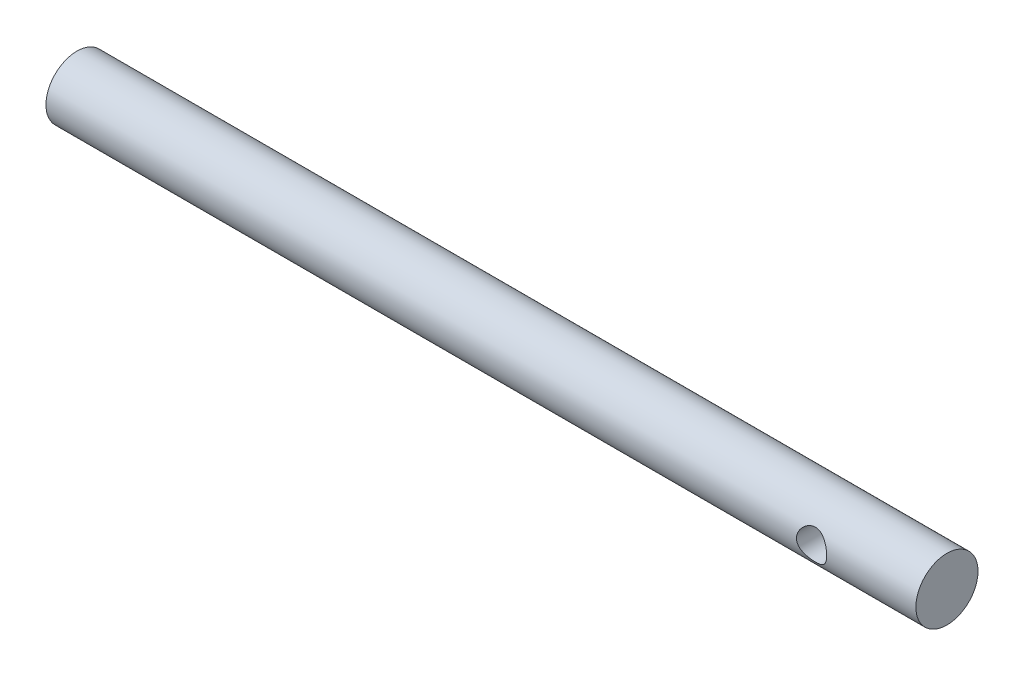
ISO-10303-21;
HEADER;
FILE_DESCRIPTION(('STEP AP214'),'2;1');
FILE_NAME('part.step','',(''),(''),'','','');
FILE_SCHEMA(('AUTOMOTIVE_DESIGN { 1 0 10303 214 1 1 1 1 }'));
ENDSEC;
DATA;
#1=APPLICATION_CONTEXT('core data for automotive mechanical design processes');
#2=APPLICATION_PROTOCOL_DEFINITION('international standard','automotive_design',2000,#1);
#3=PRODUCT_CONTEXT('',#1,'mechanical');
#4=PRODUCT('Part','Part','',(#3));
#5=PRODUCT_RELATED_PRODUCT_CATEGORY('part','',(#4));
#6=PRODUCT_DEFINITION_FORMATION('','',#4);
#7=PRODUCT_DEFINITION_CONTEXT('part definition',#1,'design');
#8=PRODUCT_DEFINITION('design','',#6,#7);
#9=PRODUCT_DEFINITION_SHAPE('','',#8);
#10=(LENGTH_UNIT() NAMED_UNIT(*) SI_UNIT(.MILLI.,.METRE.));
#11=(NAMED_UNIT(*) PLANE_ANGLE_UNIT() SI_UNIT($,.RADIAN.));
#12=(NAMED_UNIT(*) SI_UNIT($,.STERADIAN.) SOLID_ANGLE_UNIT());
#13=UNCERTAINTY_MEASURE_WITH_UNIT(LENGTH_MEASURE(1.E-05),#10,'distance_accuracy_value','');
#14=(GEOMETRIC_REPRESENTATION_CONTEXT(3) GLOBAL_UNCERTAINTY_ASSIGNED_CONTEXT((#13)) GLOBAL_UNIT_ASSIGNED_CONTEXT((#10,
#11,#12)) REPRESENTATION_CONTEXT('',''));
#15=CARTESIAN_POINT('',(0.,0.,0.));
#16=DIRECTION('',(0.,0.,1.));
#17=DIRECTION('',(1.,0.,0.));
#18=AXIS2_PLACEMENT_3D('',#15,#16,#17);
#19=CARTESIAN_POINT('',(49.,0.,0.));
#20=DIRECTION('',(-1.,0.,0.));
#21=DIRECTION('',(0.,0.,1.));
#22=AXIS2_PLACEMENT_3D('',#19,#20,#21);
#23=CYLINDRICAL_SURFACE('',#22,3.5);
#24=CARTESIAN_POINT('',(49.,0.,0.));
#25=DIRECTION('',(1.,0.,0.));
#26=DIRECTION('',(0.,0.,-1.));
#27=AXIS2_PLACEMENT_3D('',#24,#25,#26);
#28=CIRCLE('',#27,3.5);
#29=CARTESIAN_POINT('',(49.,0.,-3.49999999999999));
#30=VERTEX_POINT('',#29);
#31=EDGE_CURVE('E10',#30,#30,#28,.T.);
#32=ORIENTED_EDGE('',*,*,#31,.F.);
#33=EDGE_LOOP('',(#32));
#34=FACE_BOUND('',#33,.T.);
#35=CARTESIAN_POINT('',(-49.,0.,0.));
#36=DIRECTION('',(1.,0.,0.));
#37=DIRECTION('',(0.,0.,-1.));
#38=AXIS2_PLACEMENT_3D('',#35,#36,#37);
#39=CIRCLE('',#38,3.5);
#40=CARTESIAN_POINT('',(-49.,0.,-3.5));
#41=VERTEX_POINT('',#40);
#42=EDGE_CURVE('E51',#41,#41,#39,.T.);
#43=ORIENTED_EDGE('',*,*,#42,.T.);
#44=EDGE_LOOP('',(#43));
#45=FACE_BOUND('',#44,.T.);
#46=CARTESIAN_POINT('',(35.55,0.,-3.49999999999999));
#47=CARTESIAN_POINT('',(35.5500053723751,0.0896756953816863,-3.49999539940846));
#48=CARTESIAN_POINT('',(35.557137411082,0.179467316627251,-3.49651613180829));
#49=CARTESIAN_POINT('',(35.5853591509432,0.356415853893428,-3.48294153795161));
#50=CARTESIAN_POINT('',(35.6064773166589,0.443567016997578,-3.4728327196457));
#51=CARTESIAN_POINT('',(35.661660840534,0.612401330099423,-3.44706113400838));
#52=CARTESIAN_POINT('',(35.6956768669738,0.694103936802856,-3.43141954352767));
#53=CARTESIAN_POINT('',(35.7754448267484,0.850530713829402,-3.39603267485626));
#54=CARTESIAN_POINT('',(35.8211953929622,0.925255695691441,-3.37628787475679));
#55=CARTESIAN_POINT('',(35.9261624544671,1.07048646353177,-3.33318539392002));
#56=CARTESIAN_POINT('',(35.9860063637197,1.14049569518364,-3.3096845398156));
#57=CARTESIAN_POINT('',(36.1161163457345,1.2699367370952,-3.26221134364195));
#58=CARTESIAN_POINT('',(36.1863898173101,1.32936097188744,-3.23823867742373));
#59=CARTESIAN_POINT('',(36.3414536129895,1.44023139192917,-3.19055406218534));
#60=CARTESIAN_POINT('',(36.4269253000702,1.49079341721295,-3.16698553760054));
#61=CARTESIAN_POINT('',(36.6064358029226,1.57661108306252,-3.1251547668024));
#62=CARTESIAN_POINT('',(36.700468712635,1.61187718033903,-3.10688889838339));
#63=CARTESIAN_POINT('',(36.8888150297183,1.66388700899557,-3.07933536850597));
#64=CARTESIAN_POINT('',(36.9827927046304,1.68159043638042,-3.06958650019304));
#65=CARTESIAN_POINT('',(37.172848947353,1.70092598793138,-3.05891924050297));
#66=CARTESIAN_POINT('',(37.268925564533,1.70257244676056,-3.05799297287378));
#67=CARTESIAN_POINT('',(37.4489752029416,1.69045398551722,-3.06470061621129));
#68=CARTESIAN_POINT('',(37.5331055648645,1.67838334351683,-3.07139359376366));
#69=CARTESIAN_POINT('',(37.6979524087389,1.64209165878018,-3.09094733930902));
#70=CARTESIAN_POINT('',(37.7786678935885,1.61786709343783,-3.10380989540089));
#71=CARTESIAN_POINT('',(37.9366817626431,1.55749576419697,-3.13454492968829));
#72=CARTESIAN_POINT('',(38.0138566599233,1.52108429090292,-3.15252718612714));
#73=CARTESIAN_POINT('',(38.1613614952234,1.43757150842962,-3.19147437904442));
#74=CARTESIAN_POINT('',(38.2316883610022,1.39046543260207,-3.21244064395383));
#75=CARTESIAN_POINT('',(38.372294176781,1.28036911494261,-3.25800647402137));
#76=CARTESIAN_POINT('',(38.4415755080133,1.21615683878016,-3.28274181960351));
#77=CARTESIAN_POINT('',(38.5687876817409,1.07689280263092,-3.33102589218161));
#78=CARTESIAN_POINT('',(38.6267136719831,1.00183643254441,-3.35457410872639));
#79=CARTESIAN_POINT('',(38.731812974068,0.839043870311133,-3.39903015751018));
#80=CARTESIAN_POINT('',(38.7784397342607,0.750910502501838,-3.41978769474006));
#81=CARTESIAN_POINT('',(38.8558349426374,0.566785318859992,-3.45507068657825));
#82=CARTESIAN_POINT('',(38.8866153073456,0.470799471247903,-3.46960082282431));
#83=CARTESIAN_POINT('',(38.929032236538,0.28189261886233,-3.48981839184007));
#84=CARTESIAN_POINT('',(38.9419978635701,0.189336044763265,-3.49611775101836));
#85=CARTESIAN_POINT('',(38.9525485633474,0.0031595761315409,-3.50123499470571));
#86=CARTESIAN_POINT('',(38.9501403259087,-0.0904598382140665,-3.50005613330506));
#87=CARTESIAN_POINT('',(38.9308186291129,-0.26892879796299,-3.49071506966121));
#88=CARTESIAN_POINT('',(38.9149650612239,-0.353923485471058,-3.48306323907214));
#89=CARTESIAN_POINT('',(38.8708303231691,-0.519889247662173,-3.46218343104434));
#90=CARTESIAN_POINT('',(38.8425477471507,-0.600859866026815,-3.44895482281988));
#91=CARTESIAN_POINT('',(38.7735597760054,-0.759243255732134,-3.41764006757537));
#92=CARTESIAN_POINT('',(38.7325107986414,-0.836479268622267,-3.39942148259232));
#93=CARTESIAN_POINT('',(38.6395358018324,-0.983231788516179,-3.35991662677056));
#94=CARTESIAN_POINT('',(38.5876050550235,-1.05274492032133,-3.33862902391745));
#95=CARTESIAN_POINT('',(38.4687029130208,-1.18898546607153,-3.29271218355646));
#96=CARTESIAN_POINT('',(38.4007774247795,-1.25483940537628,-3.26795682180154));
#97=CARTESIAN_POINT('',(38.2547134412761,-1.37458241948863,-3.21942638668646));
#98=CARTESIAN_POINT('',(38.1765689011136,-1.42846436114869,-3.19565190458545));
#99=CARTESIAN_POINT('',(38.0081648639147,-1.52478586589063,-3.15086826297694));
#100=CARTESIAN_POINT('',(37.9175388957536,-1.56666259597845,-3.1300133743454));
#101=CARTESIAN_POINT('',(37.7291796170817,-1.63412429416305,-3.09533506777101));
#102=CARTESIAN_POINT('',(37.6314550927189,-1.65972903236423,-3.08150312123742));
#103=CARTESIAN_POINT('',(37.4415114195141,-1.69165858519211,-3.06408097097614));
#104=CARTESIAN_POINT('',(37.3496367136011,-1.69956772940746,-3.05965118148304));
#105=CARTESIAN_POINT('',(37.1658133015333,-1.70039716793023,-3.05919173966704));
#106=CARTESIAN_POINT('',(37.0738646337807,-1.69332284171251,-3.06315907254766));
#107=CARTESIAN_POINT('',(36.9007332004393,-1.66584532778301,-3.07817582078756));
#108=CARTESIAN_POINT('',(36.8193006162608,-1.64662904433403,-3.08859307975021));
#109=CARTESIAN_POINT('',(36.6608815862105,-1.59682153528451,-3.11463417188391));
#110=CARTESIAN_POINT('',(36.5838965240116,-1.56622679150365,-3.13025961525221));
#111=CARTESIAN_POINT('',(36.430852983517,-1.49221429547022,-3.16624293517704));
#112=CARTESIAN_POINT('',(36.3552040496375,-1.44807328729915,-3.18684818181704));
#113=CARTESIAN_POINT('',(36.2119034725558,-1.34905500369902,-3.23001034259301));
#114=CARTESIAN_POINT('',(36.1442558632688,-1.2941723495072,-3.25256823132409));
#115=CARTESIAN_POINT('',(36.0109988018856,-1.16799409574847,-3.30012481927582));
#116=CARTESIAN_POINT('',(35.946469306425,-1.09554795110436,-3.32511344994222));
#117=CARTESIAN_POINT('',(35.8302743123696,-0.940102971414071,-3.37235811234783));
#118=CARTESIAN_POINT('',(35.7786153291097,-0.857098823660054,-3.39461275720585));
#119=CARTESIAN_POINT('',(35.6898683287502,-0.682351949193356,-3.43401018783732));
#120=CARTESIAN_POINT('',(35.6527979895868,-0.590598786922934,-3.45114676571959));
#121=CARTESIAN_POINT('',(35.5950779113332,-0.401212243294464,-3.4782335251314));
#122=CARTESIAN_POINT('',(35.5743805001216,-0.303596830357162,-3.48820456233759));
#123=CARTESIAN_POINT('',(35.558262914899,-0.170891099951093,-3.49599313386021));
#124=CARTESIAN_POINT('',(35.5551682262268,-0.136809564919142,-3.49749221675948));
#125=CARTESIAN_POINT('',(35.5510357161867,-0.0684909939943334,-3.49949654130655));
#126=CARTESIAN_POINT('',(35.5499979478822,-0.0342539541126767,-3.50000175731507));
#127=CARTESIAN_POINT('',(35.55,0.,-3.49999999999999));
#128=B_SPLINE_CURVE_WITH_KNOTS('',3,(#46,#47,#48,#49,#50,#51,#52,#53,#54,#55,#56,#57,#58,#59,
#60,#61,#62,#63,#64,#65,#66,#67,#68,#69,#70,#71,#72,#73,#74,#75,#76,#77,#78,#79,#80,#81,#82,#83,
#84,#85,#86,#87,#88,#89,#90,#91,#92,#93,#94,#95,#96,#97,#98,#99,#100,#101,#102,#103,#104,#105,
#106,#107,#108,#109,#110,#111,#112,#113,#114,#115,#116,#117,#118,#119,#120,#121,#122,#123,#124,
#125,#126,#127),.UNSPECIFIED.,.T.,.F.,(4,2,2,2,2,2,2,2,2,2,2,2,2,2,2,2,2,2,2,2,2,2,2,2,2,2,2,2,
2,2,2,2,2,2,2,2,2,2,2,2,4),(0.,0.268887687140705,0.538324303048221,0.806740606925696,
1.07512565341812,1.35908673790846,1.64325023812897,1.9479024600614,2.25234608395246,
2.53904682049131,2.82549158498545,3.08006671023077,3.33471566236738,3.59529966787887,
3.85600004604811,4.14766186350512,4.43944804065819,4.74335370234189,5.04703049124303,
5.32652937628635,5.6059066478803,5.86511173893268,6.12434615637607,6.39126951599143,
6.65830907634567,6.95040651611498,7.24267752924817,7.54698910763996,7.85093024385816,
8.12633745853658,8.40164581126933,8.65349917194615,8.90543046963388,9.17428318520365,
9.44327087188504,9.7424338286204,10.0417479218777,10.3414236033631,10.6402234912566,
10.7429294570132,10.8456380722916),.UNSPECIFIED.);
#129=CARTESIAN_POINT('',(35.55,0.,-3.49999999999999));
#130=VERTEX_POINT('',#129);
#131=EDGE_CURVE('E57',#130,#130,#128,.T.);
#132=ORIENTED_EDGE('',*,*,#131,.F.);
#133=EDGE_LOOP('',(#132));
#134=FACE_BOUND('',#133,.T.);
#135=CARTESIAN_POINT('',(38.95,0.,3.50000000000001));
#136=CARTESIAN_POINT('',(38.9499946276248,0.0896756953816863,3.49999539940847));
#137=CARTESIAN_POINT('',(38.942862588918,0.179467316627251,3.4965161318083));
#138=CARTESIAN_POINT('',(38.9146408490568,0.356415853893428,3.48294153795162));
#139=CARTESIAN_POINT('',(38.8935226833411,0.443567016997578,3.47283271964571));
#140=CARTESIAN_POINT('',(38.838339159466,0.612401330099423,3.44706113400839));
#141=CARTESIAN_POINT('',(38.8043231330262,0.694103936802856,3.43141954352768));
#142=CARTESIAN_POINT('',(38.7245551732516,0.850530713829402,3.39603267485627));
#143=CARTESIAN_POINT('',(38.6788046070378,0.925255695691441,3.3762878747568));
#144=CARTESIAN_POINT('',(38.5738375455329,1.07048646353177,3.33318539392003));
#145=CARTESIAN_POINT('',(38.5139936362803,1.14049569518364,3.30968453981561));
#146=CARTESIAN_POINT('',(38.3838836542654,1.2699367370952,3.26221134364196));
#147=CARTESIAN_POINT('',(38.3136101826899,1.32936097188744,3.23823867742374));
#148=CARTESIAN_POINT('',(38.1585463870105,1.44023139192917,3.19055406218535));
#149=CARTESIAN_POINT('',(38.0730746999298,1.49079341721295,3.16698553760055));
#150=CARTESIAN_POINT('',(37.8935641970774,1.57661108306252,3.12515476680242));
#151=CARTESIAN_POINT('',(37.799531287365,1.61187718033903,3.10688889838341));
#152=CARTESIAN_POINT('',(37.6111849702817,1.66388700899556,3.07933536850598));
#153=CARTESIAN_POINT('',(37.5172072953696,1.68159043638041,3.06958650019305));
#154=CARTESIAN_POINT('',(37.327151052647,1.70092598793138,3.05891924050298));
#155=CARTESIAN_POINT('',(37.231074435467,1.70257244676056,3.05799297287379));
#156=CARTESIAN_POINT('',(37.0510247970584,1.69045398551722,3.0647006162113));
#157=CARTESIAN_POINT('',(36.9668944351355,1.67838334351683,3.07139359376368));
#158=CARTESIAN_POINT('',(36.8020475912611,1.64209165878018,3.09094733930903));
#159=CARTESIAN_POINT('',(36.7213321064115,1.61786709343783,3.1038098954009));
#160=CARTESIAN_POINT('',(36.5633182373569,1.55749576419697,3.1345449296883));
#161=CARTESIAN_POINT('',(36.4861433400767,1.52108429090292,3.15252718612715));
#162=CARTESIAN_POINT('',(36.3386385047766,1.43757150842962,3.19147437904443));
#163=CARTESIAN_POINT('',(36.2683116389978,1.39046543260207,3.21244064395384));
#164=CARTESIAN_POINT('',(36.127705823219,1.28036911494261,3.25800647402138));
#165=CARTESIAN_POINT('',(36.0584244919867,1.21615683878016,3.28274181960353));
#166=CARTESIAN_POINT('',(35.9312123182591,1.07689280263092,3.33102589218162));
#167=CARTESIAN_POINT('',(35.8732863280169,1.00183643254441,3.3545741087264));
#168=CARTESIAN_POINT('',(35.768187025932,0.839043870311133,3.39903015751019));
#169=CARTESIAN_POINT('',(35.7215602657393,0.750910502501838,3.41978769474007));
#170=CARTESIAN_POINT('',(35.6441650573626,0.566785318859992,3.45507068657826));
#171=CARTESIAN_POINT('',(35.6133846926544,0.470799471247902,3.46960082282432));
#172=CARTESIAN_POINT('',(35.570967763462,0.281892618862329,3.48981839184008));
#173=CARTESIAN_POINT('',(35.5580021364299,0.189336044763265,3.49611775101837));
#174=CARTESIAN_POINT('',(35.5474514366526,0.00315957613154045,3.50123499470572));
#175=CARTESIAN_POINT('',(35.5498596740913,-0.090459838214067,3.50005613330507));
#176=CARTESIAN_POINT('',(35.5691813708871,-0.268928797962991,3.49071506966122));
#177=CARTESIAN_POINT('',(35.5850349387761,-0.353923485471059,3.48306323907215));
#178=CARTESIAN_POINT('',(35.6291696768309,-0.519889247662174,3.46218343104435));
#179=CARTESIAN_POINT('',(35.6574522528493,-0.600859866026816,3.44895482281989));
#180=CARTESIAN_POINT('',(35.7264402239946,-0.759243255732134,3.41764006757538));
#181=CARTESIAN_POINT('',(35.7674892013586,-0.836479268622267,3.39942148259233));
#182=CARTESIAN_POINT('',(35.8604641981676,-0.983231788516179,3.35991662677057));
#183=CARTESIAN_POINT('',(35.9123949449765,-1.05274492032133,3.33862902391746));
#184=CARTESIAN_POINT('',(36.0312970869792,-1.18898546607153,3.29271218355647));
#185=CARTESIAN_POINT('',(36.0992225752205,-1.25483940537628,3.26795682180155));
#186=CARTESIAN_POINT('',(36.2452865587239,-1.37458241948862,3.21942638668647));
#187=CARTESIAN_POINT('',(36.3234310988864,-1.42846436114869,3.19565190458547));
#188=CARTESIAN_POINT('',(36.4918351360853,-1.52478586589063,3.15086826297695));
#189=CARTESIAN_POINT('',(36.5824611042464,-1.56666259597845,3.13001337434541));
#190=CARTESIAN_POINT('',(36.7708203829183,-1.63412429416305,3.09533506777102));
#191=CARTESIAN_POINT('',(36.8685449072811,-1.65972903236423,3.08150312123743));
#192=CARTESIAN_POINT('',(37.0584885804859,-1.69165858519211,3.06408097097615));
#193=CARTESIAN_POINT('',(37.1503632863989,-1.69956772940746,3.05965118148305));
#194=CARTESIAN_POINT('',(37.3341866984667,-1.70039716793023,3.05919173966705));
#195=CARTESIAN_POINT('',(37.4261353662193,-1.69332284171251,3.06315907254767));
#196=CARTESIAN_POINT('',(37.5992667995607,-1.66584532778301,3.07817582078757));
#197=CARTESIAN_POINT('',(37.6806993837392,-1.64662904433403,3.08859307975022));
#198=CARTESIAN_POINT('',(37.8391184137895,-1.59682153528451,3.11463417188392));
#199=CARTESIAN_POINT('',(37.9161034759884,-1.56622679150365,3.13025961525222));
#200=CARTESIAN_POINT('',(38.069147016483,-1.49221429547022,3.16624293517705));
#201=CARTESIAN_POINT('',(38.1447959503624,-1.44807328729915,3.18684818181705));
#202=CARTESIAN_POINT('',(38.2880965274442,-1.34905500369902,3.23001034259302));
#203=CARTESIAN_POINT('',(38.3557441367312,-1.2941723495072,3.2525682313241));
#204=CARTESIAN_POINT('',(38.4890011981144,-1.16799409574847,3.30012481927583));
#205=CARTESIAN_POINT('',(38.553530693575,-1.09554795110436,3.32511344994223));
#206=CARTESIAN_POINT('',(38.6697256876304,-0.940102971414071,3.37235811234784));
#207=CARTESIAN_POINT('',(38.7213846708903,-0.857098823660055,3.39461275720586));
#208=CARTESIAN_POINT('',(38.8101316712498,-0.682351949193357,3.43401018783733));
#209=CARTESIAN_POINT('',(38.8472020104132,-0.590598786922935,3.4511467657196));
#210=CARTESIAN_POINT('',(38.9049220886668,-0.401212243294464,3.47823352513141));
#211=CARTESIAN_POINT('',(38.9256194998784,-0.303596830357162,3.4882045623376));
#212=CARTESIAN_POINT('',(38.941737085101,-0.170891099951094,3.49599313386022));
#213=CARTESIAN_POINT('',(38.9448317737732,-0.136809564919143,3.49749221675949));
#214=CARTESIAN_POINT('',(38.9489642838133,-0.0684909939943345,3.49949654130656));
#215=CARTESIAN_POINT('',(38.9500020521178,-0.0342539541126772,3.50000175731508));
#216=CARTESIAN_POINT('',(38.95,0.,3.50000000000001));
#217=B_SPLINE_CURVE_WITH_KNOTS('',3,(#135,#136,#137,#138,#139,#140,#141,#142,#143,#144,#145,
#146,#147,#148,#149,#150,#151,#152,#153,#154,#155,#156,#157,#158,#159,#160,#161,#162,#163,#164,
#165,#166,#167,#168,#169,#170,#171,#172,#173,#174,#175,#176,#177,#178,#179,#180,#181,#182,#183,
#184,#185,#186,#187,#188,#189,#190,#191,#192,#193,#194,#195,#196,#197,#198,#199,#200,#201,#202,
#203,#204,#205,#206,#207,#208,#209,#210,#211,#212,#213,#214,#215,#216),.UNSPECIFIED.,.T.,.F.,(4,
2,2,2,2,2,2,2,2,2,2,2,2,2,2,2,2,2,2,2,2,2,2,2,2,2,2,2,2,2,2,2,2,2,2,2,2,2,2,2,4),(0.,
0.268887687140705,0.538324303048221,0.806740606925696,1.07512565341812,1.35908673790846,
1.64325023812897,1.94790246006139,2.25234608395246,2.53904682049129,2.82549158498545,
3.08006671023077,3.33471566236738,3.59529966787887,3.85600004604811,4.14766186350512,
4.43944804065819,4.74335370234189,5.04703049124303,5.32652937628635,5.6059066478803,
5.86511173893268,6.12434615637607,6.39126951599143,6.65830907634568,6.95040651611497,
7.24267752924817,7.54698910763996,7.85093024385816,8.12633745853658,8.40164581126933,
8.65349917194615,8.90543046963388,9.17428318520365,9.44327087188504,9.74243382862039,
10.0417479218777,10.3414236033631,10.6402234912566,10.7429294570132,10.8456380722916),.UNSPECIFIED.);
#218=CARTESIAN_POINT('',(38.95,0.,3.50000000000001));
#219=VERTEX_POINT('',#218);
#220=EDGE_CURVE('E43',#219,#219,#217,.T.);
#221=ORIENTED_EDGE('',*,*,#220,.F.);
#222=EDGE_LOOP('',(#221));
#223=FACE_BOUND('',#222,.T.);
#224=ADVANCED_FACE('F39',(#34,#45,#134,#223),#23,.T.);
#225=CARTESIAN_POINT('',(49.,0.,0.));
#226=DIRECTION('',(1.,0.,0.));
#227=DIRECTION('',(0.,0.,-1.));
#228=AXIS2_PLACEMENT_3D('',#225,#226,#227);
#229=PLANE('',#228);
#230=ORIENTED_EDGE('',*,*,#31,.T.);
#231=EDGE_LOOP('',(#230));
#232=FACE_BOUND('',#231,.T.);
#233=ADVANCED_FACE('F68',(#232),#229,.T.);
#234=CARTESIAN_POINT('',(-49.,0.,0.));
#235=DIRECTION('',(1.,0.,0.));
#236=DIRECTION('',(0.,0.,-1.));
#237=AXIS2_PLACEMENT_3D('',#234,#235,#236);
#238=PLANE('',#237);
#239=ORIENTED_EDGE('',*,*,#42,.F.);
#240=EDGE_LOOP('',(#239));
#241=FACE_BOUND('',#240,.T.);
#242=ADVANCED_FACE('F66',(#241),#238,.F.);
#243=CARTESIAN_POINT('',(37.25,0.,10.));
#244=DIRECTION('',(0.,0.,-1.));
#245=DIRECTION('',(-1.,0.,0.));
#246=AXIS2_PLACEMENT_3D('',#243,#244,#245);
#247=CYLINDRICAL_SURFACE('',#246,1.7);
#248=ORIENTED_EDGE('',*,*,#131,.T.);
#249=EDGE_LOOP('',(#248));
#250=FACE_BOUND('',#249,.T.);
#251=ORIENTED_EDGE('',*,*,#220,.T.);
#252=EDGE_LOOP('',(#251));
#253=FACE_BOUND('',#252,.T.);
#254=ADVANCED_FACE('F62',(#250,#253),#247,.F.);
#255=CLOSED_SHELL('',(#224,#233,#242,#254));
#256=MANIFOLD_SOLID_BREP('B2',#255);
#257=ADVANCED_BREP_SHAPE_REPRESENTATION('',(#18,#256),#14);
#258=SHAPE_DEFINITION_REPRESENTATION(#9,#257);
ENDSEC;
END-ISO-10303-21;
